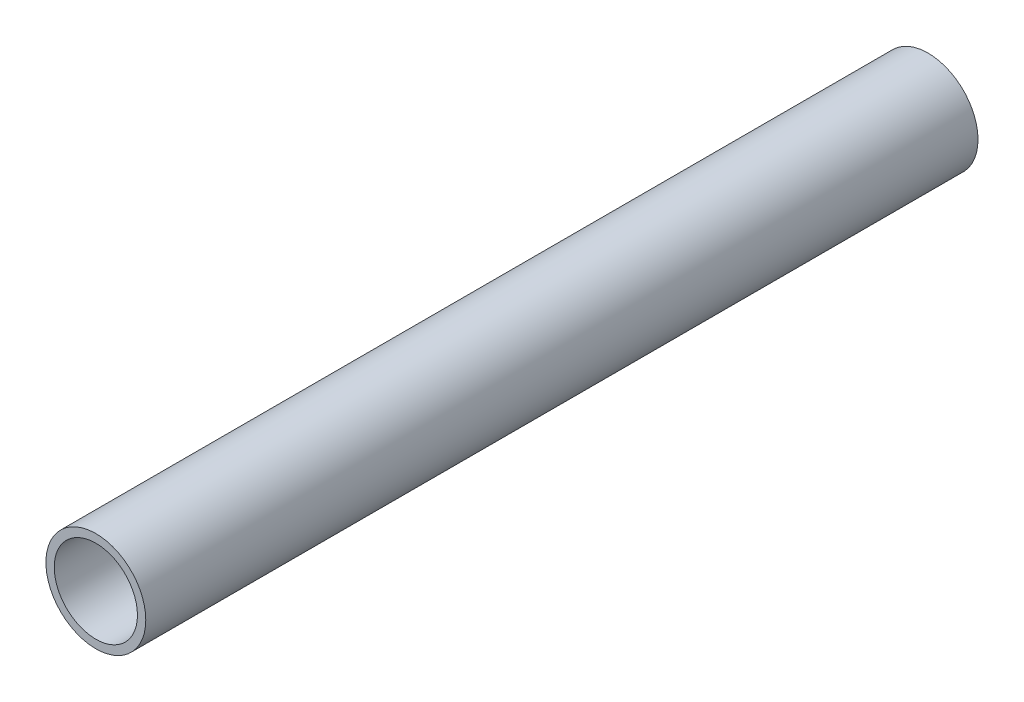
ISO-10303-21;
HEADER;
FILE_DESCRIPTION(('STEP AP214'),'2;1');
FILE_NAME('part.step','',(''),(''),'','','');
FILE_SCHEMA(('AUTOMOTIVE_DESIGN { 1 0 10303 214 1 1 1 1 }'));
ENDSEC;
DATA;
#1=APPLICATION_CONTEXT('core data for automotive mechanical design processes');
#2=APPLICATION_PROTOCOL_DEFINITION('international standard','automotive_design',2000,#1);
#3=PRODUCT_CONTEXT('',#1,'mechanical');
#4=PRODUCT('Part','Part','',(#3));
#5=PRODUCT_RELATED_PRODUCT_CATEGORY('part','',(#4));
#6=PRODUCT_DEFINITION_FORMATION('','',#4);
#7=PRODUCT_DEFINITION_CONTEXT('part definition',#1,'design');
#8=PRODUCT_DEFINITION('design','',#6,#7);
#9=PRODUCT_DEFINITION_SHAPE('','',#8);
#10=(LENGTH_UNIT() NAMED_UNIT(*) SI_UNIT(.MILLI.,.METRE.));
#11=(NAMED_UNIT(*) PLANE_ANGLE_UNIT() SI_UNIT($,.RADIAN.));
#12=(NAMED_UNIT(*) SI_UNIT($,.STERADIAN.) SOLID_ANGLE_UNIT());
#13=UNCERTAINTY_MEASURE_WITH_UNIT(LENGTH_MEASURE(1.E-05),#10,'distance_accuracy_value','');
#14=(GEOMETRIC_REPRESENTATION_CONTEXT(3) GLOBAL_UNCERTAINTY_ASSIGNED_CONTEXT((#13)) GLOBAL_UNIT_ASSIGNED_CONTEXT((#10,
#11,#12)) REPRESENTATION_CONTEXT('',''));
#15=CARTESIAN_POINT('',(0.,0.,0.));
#16=DIRECTION('',(0.,0.,1.));
#17=DIRECTION('',(1.,0.,0.));
#18=AXIS2_PLACEMENT_3D('',#15,#16,#17);
#19=CARTESIAN_POINT('',(0.,0.,100.));
#20=DIRECTION('',(0.,0.,1.));
#21=DIRECTION('',(1.,0.,0.));
#22=AXIS2_PLACEMENT_3D('',#19,#20,#21);
#23=PLANE('',#22);
#24=CARTESIAN_POINT('',(0.,0.,100.));
#25=DIRECTION('',(0.,0.,1.));
#26=DIRECTION('',(1.,0.,0.));
#27=AXIS2_PLACEMENT_3D('',#24,#25,#26);
#28=CIRCLE('',#27,6.);
#29=CARTESIAN_POINT('',(6.,0.,100.));
#30=VERTEX_POINT('',#29);
#31=EDGE_CURVE('E10',#30,#30,#28,.T.);
#32=ORIENTED_EDGE('',*,*,#31,.T.);
#33=EDGE_LOOP('',(#32));
#34=FACE_BOUND('',#33,.T.);
#35=CARTESIAN_POINT('',(0.,0.,100.));
#36=DIRECTION('',(0.,0.,1.));
#37=DIRECTION('',(1.,0.,0.));
#38=AXIS2_PLACEMENT_3D('',#35,#36,#37);
#39=CIRCLE('',#38,5.);
#40=CARTESIAN_POINT('',(5.,0.,100.));
#41=VERTEX_POINT('',#40);
#42=EDGE_CURVE('E50',#41,#41,#39,.T.);
#43=ORIENTED_EDGE('',*,*,#42,.F.);
#44=EDGE_LOOP('',(#43));
#45=FACE_BOUND('',#44,.T.);
#46=ADVANCED_FACE('F39',(#34,#45),#23,.T.);
#47=CARTESIAN_POINT('',(0.,0.,0.));
#48=DIRECTION('',(0.,0.,1.));
#49=DIRECTION('',(1.,0.,0.));
#50=AXIS2_PLACEMENT_3D('',#47,#48,#49);
#51=PLANE('',#50);
#52=CARTESIAN_POINT('',(0.,0.,0.));
#53=DIRECTION('',(0.,0.,1.));
#54=DIRECTION('',(1.,0.,0.));
#55=AXIS2_PLACEMENT_3D('',#52,#53,#54);
#56=CIRCLE('',#55,6.);
#57=CARTESIAN_POINT('',(6.,0.,0.));
#58=VERTEX_POINT('',#57);
#59=EDGE_CURVE('E43',#58,#58,#56,.T.);
#60=ORIENTED_EDGE('',*,*,#59,.F.);
#61=EDGE_LOOP('',(#60));
#62=FACE_BOUND('',#61,.T.);
#63=CARTESIAN_POINT('',(0.,0.,0.));
#64=DIRECTION('',(0.,0.,1.));
#65=DIRECTION('',(1.,0.,0.));
#66=AXIS2_PLACEMENT_3D('',#63,#64,#65);
#67=CIRCLE('',#66,5.);
#68=CARTESIAN_POINT('',(5.,0.,0.));
#69=VERTEX_POINT('',#68);
#70=EDGE_CURVE('E52',#69,#69,#67,.T.);
#71=ORIENTED_EDGE('',*,*,#70,.T.);
#72=EDGE_LOOP('',(#71));
#73=FACE_BOUND('',#72,.T.);
#74=ADVANCED_FACE('F62',(#62,#73),#51,.F.);
#75=CARTESIAN_POINT('',(0.,0.,100.));
#76=DIRECTION('',(0.,0.,-1.));
#77=DIRECTION('',(-1.,0.,0.));
#78=AXIS2_PLACEMENT_3D('',#75,#76,#77);
#79=CYLINDRICAL_SURFACE('',#78,6.);
#80=ORIENTED_EDGE('',*,*,#31,.F.);
#81=EDGE_LOOP('',(#80));
#82=FACE_BOUND('',#81,.T.);
#83=ORIENTED_EDGE('',*,*,#59,.T.);
#84=EDGE_LOOP('',(#83));
#85=FACE_BOUND('',#84,.T.);
#86=ADVANCED_FACE('F41',(#82,#85),#79,.T.);
#87=CARTESIAN_POINT('',(0.,0.,100.));
#88=DIRECTION('',(0.,0.,-1.));
#89=DIRECTION('',(-1.,0.,0.));
#90=AXIS2_PLACEMENT_3D('',#87,#88,#89);
#91=CYLINDRICAL_SURFACE('',#90,5.);
#92=ORIENTED_EDGE('',*,*,#42,.T.);
#93=EDGE_LOOP('',(#92));
#94=FACE_BOUND('',#93,.T.);
#95=ORIENTED_EDGE('',*,*,#70,.F.);
#96=EDGE_LOOP('',(#95));
#97=FACE_BOUND('',#96,.T.);
#98=ADVANCED_FACE('F58',(#94,#97),#91,.F.);
#99=CLOSED_SHELL('',(#46,#74,#86,#98));
#100=MANIFOLD_SOLID_BREP('B2',#99);
#101=ADVANCED_BREP_SHAPE_REPRESENTATION('',(#18,#100),#14);
#102=SHAPE_DEFINITION_REPRESENTATION(#9,#101);
ENDSEC;
END-ISO-10303-21;
